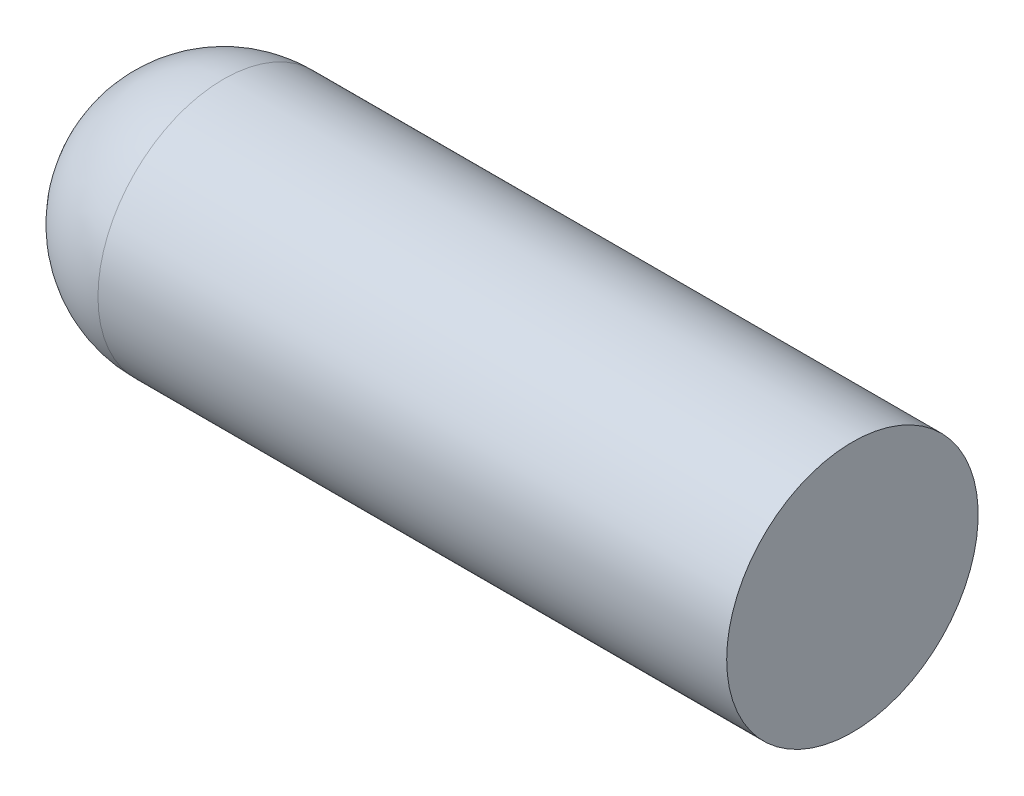
ISO-10303-21;
HEADER;
FILE_DESCRIPTION(('STEP AP214'),'2;1');
FILE_NAME('part.step','',(''),(''),'','','');
FILE_SCHEMA(('AUTOMOTIVE_DESIGN { 1 0 10303 214 1 1 1 1 }'));
ENDSEC;
DATA;
#1=APPLICATION_CONTEXT('core data for automotive mechanical design processes');
#2=APPLICATION_PROTOCOL_DEFINITION('international standard','automotive_design',2000,#1);
#3=PRODUCT_CONTEXT('',#1,'mechanical');
#4=PRODUCT('Part','Part','',(#3));
#5=PRODUCT_RELATED_PRODUCT_CATEGORY('part','',(#4));
#6=PRODUCT_DEFINITION_FORMATION('','',#4);
#7=PRODUCT_DEFINITION_CONTEXT('part definition',#1,'design');
#8=PRODUCT_DEFINITION('design','',#6,#7);
#9=PRODUCT_DEFINITION_SHAPE('','',#8);
#10=(LENGTH_UNIT() NAMED_UNIT(*) SI_UNIT(.MILLI.,.METRE.));
#11=(NAMED_UNIT(*) PLANE_ANGLE_UNIT() SI_UNIT($,.RADIAN.));
#12=(NAMED_UNIT(*) SI_UNIT($,.STERADIAN.) SOLID_ANGLE_UNIT());
#13=UNCERTAINTY_MEASURE_WITH_UNIT(LENGTH_MEASURE(1.E-05),#10,'distance_accuracy_value','');
#14=(GEOMETRIC_REPRESENTATION_CONTEXT(3) GLOBAL_UNCERTAINTY_ASSIGNED_CONTEXT((#13)) GLOBAL_UNIT_ASSIGNED_CONTEXT((#10,
#11,#12)) REPRESENTATION_CONTEXT('',''));
#15=CARTESIAN_POINT('',(0.,0.,0.));
#16=DIRECTION('',(0.,0.,1.));
#17=DIRECTION('',(1.,0.,0.));
#18=AXIS2_PLACEMENT_3D('',#15,#16,#17);
#19=CARTESIAN_POINT('',(0.,0.,0.));
#20=DIRECTION('',(-1.,0.,0.));
#21=DIRECTION('',(0.,1.,0.));
#22=AXIS2_PLACEMENT_3D('',#19,#20,#21);
#23=SPHERICAL_SURFACE('',#22,1524.);
#24=CARTESIAN_POINT('',(7.71989985270949E-05,-1.99840144432528E-12,0.));
#25=DIRECTION('',(-1.,0.,0.));
#26=DIRECTION('',(0.,0.,1.));
#27=AXIS2_PLACEMENT_3D('',#24,#25,#26);
#28=CIRCLE('',#27,1524.);
#29=CARTESIAN_POINT('',(7.71989985270949E-05,-1.99840144432528E-12,1524.));
#30=VERTEX_POINT('',#29);
#31=EDGE_CURVE('E79',#30,#30,#28,.T.);
#32=ORIENTED_EDGE('',*,*,#31,.T.);
#33=EDGE_LOOP('',(#32));
#34=FACE_BOUND('',#33,.T.);
#35=ADVANCED_FACE('F72',(#34),#23,.T.);
#36=CARTESIAN_POINT('',(7620.000077199,-1.99840144432528E-12,0.));
#37=DIRECTION('',(-1.,0.,0.));
#38=DIRECTION('',(0.,0.,1.));
#39=AXIS2_PLACEMENT_3D('',#36,#37,#38);
#40=PLANE('',#39);
#41=CARTESIAN_POINT('',(7620.000077199,-1.99840144432528E-12,0.));
#42=DIRECTION('',(-1.,0.,0.));
#43=DIRECTION('',(0.,0.,1.));
#44=AXIS2_PLACEMENT_3D('',#41,#42,#43);
#45=CIRCLE('',#44,1524.);
#46=CARTESIAN_POINT('',(7620.000077199,-1.99840144432528E-12,1524.));
#47=VERTEX_POINT('',#46);
#48=EDGE_CURVE('E12',#47,#47,#45,.T.);
#49=ORIENTED_EDGE('',*,*,#48,.F.);
#50=EDGE_LOOP('',(#49));
#51=FACE_BOUND('',#50,.T.);
#52=ADVANCED_FACE('F110',(#51),#40,.F.);
#53=CARTESIAN_POINT('',(-1524.,-1.99840144432528E-12,0.));
#54=DIRECTION('',(-1.,0.,0.));
#55=DIRECTION('',(0.,0.,1.));
#56=AXIS2_PLACEMENT_3D('',#53,#54,#55);
#57=CYLINDRICAL_SURFACE('',#56,1524.);
#58=ORIENTED_EDGE('',*,*,#31,.F.);
#59=EDGE_LOOP('',(#58));
#60=FACE_BOUND('',#59,.T.);
#61=ORIENTED_EDGE('',*,*,#48,.T.);
#62=EDGE_LOOP('',(#61));
#63=FACE_BOUND('',#62,.T.);
#64=ADVANCED_FACE('F107',(#60,#63),#57,.T.);
#65=CLOSED_SHELL('',(#35,#52,#64));
#66=CARTESIAN_POINT('',(1524.,0.,0.));
#67=DIRECTION('',(1.,0.,0.));
#68=DIRECTION('',(0.,1.,0.));
#69=AXIS2_PLACEMENT_3D('',#66,#67,#68);
#70=PLANE('',#69);
#71=CARTESIAN_POINT('',(1524.,1.84097528888039E-13,0.));
#72=DIRECTION('',(1.,0.,0.));
#73=DIRECTION('',(0.,1.,0.));
#74=AXIS2_PLACEMENT_3D('',#71,#72,#73);
#75=CIRCLE('',#74,78.3589999999998);
#76=CARTESIAN_POINT('',(1524.,78.359,0.));
#77=VERTEX_POINT('',#76);
#78=EDGE_CURVE('E93',#77,#77,#75,.T.);
#79=ORIENTED_EDGE('',*,*,#78,.F.);
#80=EDGE_LOOP('',(#79));
#81=FACE_BOUND('',#80,.T.);
#82=ADVANCED_FACE('F119',(#81),#70,.F.);
#83=CARTESIAN_POINT('',(508.,0.,0.));
#84=DIRECTION('',(1.,0.,0.));
#85=DIRECTION('',(0.,1.,0.));
#86=AXIS2_PLACEMENT_3D('',#83,#84,#85);
#87=CYLINDRICAL_SURFACE('',#86,78.359);
#88=CARTESIAN_POINT('',(508.,0.,0.));
#89=DIRECTION('',(1.,0.,0.));
#90=DIRECTION('',(0.,1.,0.));
#91=AXIS2_PLACEMENT_3D('',#88,#89,#90);
#92=CIRCLE('',#91,78.359);
#93=CARTESIAN_POINT('',(508.,78.3590000000001,0.));
#94=VERTEX_POINT('',#93);
#95=EDGE_CURVE('E90',#94,#94,#92,.T.);
#96=ORIENTED_EDGE('',*,*,#95,.F.);
#97=EDGE_LOOP('',(#96));
#98=FACE_BOUND('',#97,.T.);
#99=ORIENTED_EDGE('',*,*,#78,.T.);
#100=EDGE_LOOP('',(#99));
#101=FACE_BOUND('',#100,.T.);
#102=ADVANCED_FACE('F85',(#98,#101),#87,.F.);
#103=CARTESIAN_POINT('',(508.,78.3590000000001,0.));
#104=CARTESIAN_POINT('',(506.466506538912,78.3533865527715,0.));
#105=CARTESIAN_POINT('',(503.399758723359,78.3100117012018,0.));
#106=CARTESIAN_POINT('',(497.267203511275,78.1743864260999,0.));
#107=CARTESIAN_POINT('',(487.103143355491,77.8358657900895,0.));
#108=CARTESIAN_POINT('',(474.443672774575,77.2780067172111,0.));
#109=CARTESIAN_POINT('',(455.262955994451,76.2291909569819,0.));
#110=CARTESIAN_POINT('',(431.103668314105,74.6062080892274,0.));
#111=CARTESIAN_POINT('',(402.94385311939,72.3578215514989,0.));
#112=CARTESIAN_POINT('',(370.797101621952,69.3748151553989,0.));
#113=CARTESIAN_POINT('',(338.687218842144,66.019317565241,0.));
#114=CARTESIAN_POINT('',(306.615943820824,62.3133300043452,0.));
#115=CARTESIAN_POINT('',(274.5859325591,58.266356780265,0.));
#116=CARTESIAN_POINT('',(242.600940750101,53.8774969176258,0.));
#117=CARTESIAN_POINT('',(210.666331668604,49.1355934479414,0.));
#118=CARTESIAN_POINT('',(178.789638073683,44.0179331187811,0.));
#119=CARTESIAN_POINT('',(146.982116690261,38.4855220067455,0.));
#120=CARTESIAN_POINT('',(115.260857412618,32.4757689162783,0.));
#121=CARTESIAN_POINT('',(87.8428395219212,26.7555486962024,0.));
#122=CARTESIAN_POINT('',(64.7152060778741,21.4391039022628,0.));
#123=CARTESIAN_POINT('',(45.6256865676283,16.5950074599223,0.));
#124=CARTESIAN_POINT('',(31.8916232950011,12.776951202506,0.));
#125=CARTESIAN_POINT('',(20.431057710862,9.21610765332269,0.));
#126=CARTESIAN_POINT('',(11.8911471469212,6.1625292191336,0.));
#127=CARTESIAN_POINT('',(6.79215333620263,4.0533986101978,0.));
#128=CARTESIAN_POINT('',(3.92621998198972,2.6863652404464,0.));
#129=CARTESIAN_POINT('',(2.34218930804693,1.82185431551123,0.));
#130=CARTESIAN_POINT('',(1.44479441679255,1.26705539215756,0.));
#131=CARTESIAN_POINT('',(0.914446885529836,0.898448081037935,0.));
#132=CARTESIAN_POINT('',(0.602624186039401,0.656685654001427,0.));
#133=CARTESIAN_POINT('',(0.401947451603214,0.484306452729949,0.));
#134=CARTESIAN_POINT('',(0.274835356304458,0.363880791177356,0.));
#135=CARTESIAN_POINT('',(0.189812425286261,0.276067495807433,0.));
#136=CARTESIAN_POINT('',(0.119222388262843,0.195375450701481,0.));
#137=CARTESIAN_POINT('',(0.069784833025893,0.13164667774908,0.));
#138=CARTESIAN_POINT('',(0.03150232088995,0.0740170241349496,0.));
#139=CARTESIAN_POINT('',(0.0101037601756575,0.0330289794366481,0.));
#140=CARTESIAN_POINT('',(0.00282201094841929,0.0112206817663937,0.));
#141=CARTESIAN_POINT('',(0.,0.,0.));
#142=B_SPLINE_CURVE_WITH_KNOTS('',4,(#103,#104,#105,#106,#107,#108,#109,#110,#111,#112,#113,
#114,#115,#116,#117,#118,#119,#120,#121,#122,#123,#124,#125,#126,#127,#128,#129,#130,#131,#132,
#133,#134,#135,#136,#137,#138,#139,#140,#141),.UNSPECIFIED.,.F.,.F.,(5,1,1,1,1,1,1,1,1,1,1,1,1,
1,1,1,1,1,1,1,1,1,1,1,1,1,1,1,1,1,1,1,1,1,1,5),(0.,0.0118867171331606,0.0237734342663212,
0.0475468685326423,0.0788277031398661,0.11010853774709,0.17267020713405,0.235231877354637,
0.297793547291981,0.360355215303574,0.422916887074998,0.485478553803714,0.548040224137599,
0.610601894958506,0.67316356249182,0.735725231832568,0.798286900585068,0.860848559503119,
0.890252526568773,0.919656493634427,0.950937311025142,0.971332253827268,0.983254549434079,
0.989933318504825,0.993691635677172,0.995933780005993,0.997236088462219,0.998107592058293,
0.998695814465024,0.998990858832321,0.999285903199619,0.999464427399714,0.99964295159981,
0.999821475799905,0.999910737899952,1.),.UNSPECIFIED.);
#143=CARTESIAN_POINT('',(508.,0.,0.));
#144=DIRECTION('',(1.,0.,0.));
#145=AXIS1_PLACEMENT('',#143,#144);
#146=SURFACE_OF_REVOLUTION('',#142,#145);
#147=CARTESIAN_POINT('',(0.,0.,0.));
#148=VERTEX_POINT('',#147);
#149=VERTEX_LOOP('',#148);
#150=FACE_BOUND('',#149,.T.);
#151=ORIENTED_EDGE('',*,*,#95,.T.);
#152=EDGE_LOOP('',(#151));
#153=FACE_BOUND('',#152,.T.);
#154=ADVANCED_FACE('F82',(#150,#153),#146,.T.);
#155=CLOSED_SHELL('',(#82,#102,#154));
#156=ORIENTED_CLOSED_SHELL('',*,#155,.T.);
#157=BREP_WITH_VOIDS('B2',#65,(#156));
#158=ADVANCED_BREP_SHAPE_REPRESENTATION('',(#18,#157),#14);
#159=SHAPE_DEFINITION_REPRESENTATION(#9,#158);
ENDSEC;
END-ISO-10303-21;
